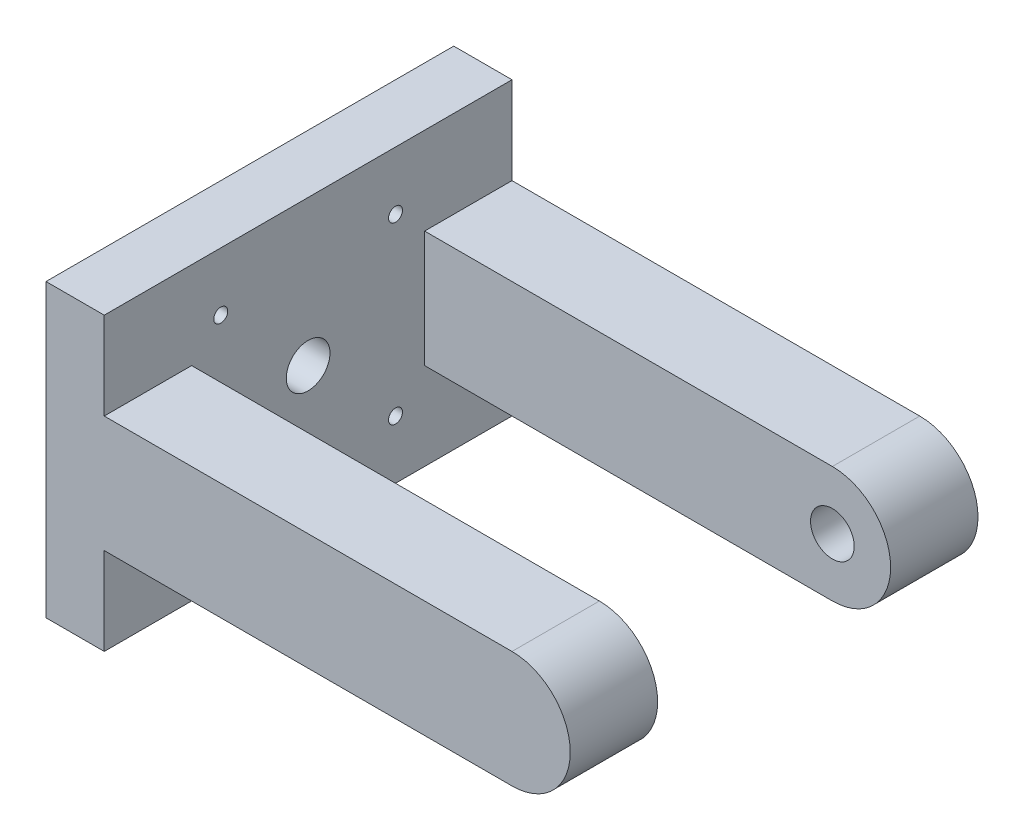
ISO-10303-21;
HEADER;
FILE_DESCRIPTION(('STEP AP214'),'2;1');
FILE_NAME('part.step','',(''),(''),'','','');
FILE_SCHEMA(('AUTOMOTIVE_DESIGN { 1 0 10303 214 1 1 1 1 }'));
ENDSEC;
DATA;
#1=APPLICATION_CONTEXT('core data for automotive mechanical design processes');
#2=APPLICATION_PROTOCOL_DEFINITION('international standard','automotive_design',2000,#1);
#3=PRODUCT_CONTEXT('',#1,'mechanical');
#4=PRODUCT('Part','Part','',(#3));
#5=PRODUCT_RELATED_PRODUCT_CATEGORY('part','',(#4));
#6=PRODUCT_DEFINITION_FORMATION('','',#4);
#7=PRODUCT_DEFINITION_CONTEXT('part definition',#1,'design');
#8=PRODUCT_DEFINITION('design','',#6,#7);
#9=PRODUCT_DEFINITION_SHAPE('','',#8);
#10=(LENGTH_UNIT() NAMED_UNIT(*) SI_UNIT(.MILLI.,.METRE.));
#11=(NAMED_UNIT(*) PLANE_ANGLE_UNIT() SI_UNIT($,.RADIAN.));
#12=(NAMED_UNIT(*) SI_UNIT($,.STERADIAN.) SOLID_ANGLE_UNIT());
#13=UNCERTAINTY_MEASURE_WITH_UNIT(LENGTH_MEASURE(1.E-05),#10,'distance_accuracy_value','');
#14=(GEOMETRIC_REPRESENTATION_CONTEXT(3) GLOBAL_UNCERTAINTY_ASSIGNED_CONTEXT((#13)) GLOBAL_UNIT_ASSIGNED_CONTEXT((#10,
#11,#12)) REPRESENTATION_CONTEXT('',''));
#15=CARTESIAN_POINT('',(0.,0.,0.));
#16=DIRECTION('',(0.,0.,1.));
#17=DIRECTION('',(1.,0.,0.));
#18=AXIS2_PLACEMENT_3D('',#15,#16,#17);
#19=CARTESIAN_POINT('',(35.,0.,-70.));
#20=DIRECTION('',(0.,0.,1.));
#21=DIRECTION('',(1.,0.,0.));
#22=AXIS2_PLACEMENT_3D('',#19,#20,#21);
#23=CYLINDRICAL_SURFACE('',#22,10.);
#24=CARTESIAN_POINT('',(35.,0.,-55.));
#25=DIRECTION('',(0.,0.,-1.));
#26=DIRECTION('',(-1.,0.,0.));
#27=AXIS2_PLACEMENT_3D('',#24,#25,#26);
#28=CIRCLE('',#27,10.);
#29=CARTESIAN_POINT('',(35.,-10.,-55.));
#30=VERTEX_POINT('',#29);
#31=CARTESIAN_POINT('',(35.,10.,-55.));
#32=VERTEX_POINT('',#31);
#33=EDGE_CURVE('E161',#30,#32,#28,.F.);
#34=ORIENTED_EDGE('',*,*,#33,.F.);
#35=DIRECTION('',(0.,0.,1.));
#36=VECTOR('',#35,1.);
#37=CARTESIAN_POINT('',(35.,-10.,-70.));
#38=LINE('',#37,#36);
#39=CARTESIAN_POINT('',(35.,-10.,-70.));
#40=VERTEX_POINT('',#39);
#41=EDGE_CURVE('E45',#40,#30,#38,.T.);
#42=ORIENTED_EDGE('',*,*,#41,.F.);
#43=CARTESIAN_POINT('',(35.,0.,-70.));
#44=DIRECTION('',(0.,0.,1.));
#45=DIRECTION('',(-1.,0.,0.));
#46=AXIS2_PLACEMENT_3D('',#43,#44,#45);
#47=CIRCLE('',#46,10.);
#48=CARTESIAN_POINT('',(35.,10.,-70.));
#49=VERTEX_POINT('',#48);
#50=EDGE_CURVE('E179',#40,#49,#47,.T.);
#51=ORIENTED_EDGE('',*,*,#50,.T.);
#52=DIRECTION('',(0.,0.,1.));
#53=VECTOR('',#52,1.);
#54=CARTESIAN_POINT('',(35.,10.,-70.));
#55=LINE('',#54,#53);
#56=EDGE_CURVE('E105',#49,#32,#55,.T.);
#57=ORIENTED_EDGE('',*,*,#56,.T.);
#58=EDGE_LOOP('',(#34,#42,#51,#57));
#59=FACE_BOUND('',#58,.T.);
#60=ADVANCED_FACE('F36',(#59),#23,.T.);
#61=CARTESIAN_POINT('',(-35.,-10.,-70.));
#62=DIRECTION('',(0.,-1.,0.));
#63=DIRECTION('',(0.,0.,-1.));
#64=AXIS2_PLACEMENT_3D('',#61,#62,#63);
#65=PLANE('',#64);
#66=DIRECTION('',(1.,0.,0.));
#67=VECTOR('',#66,1.);
#68=CARTESIAN_POINT('',(-35.,-10.,-55.));
#69=LINE('',#68,#67);
#70=CARTESIAN_POINT('',(-35.,-10.,-55.));
#71=VERTEX_POINT('',#70);
#72=EDGE_CURVE('E253',#71,#30,#69,.T.);
#73=ORIENTED_EDGE('',*,*,#72,.F.);
#74=DIRECTION('',(0.,0.,1.));
#75=VECTOR('',#74,1.);
#76=CARTESIAN_POINT('',(-35.,-10.,-70.));
#77=LINE('',#76,#75);
#78=CARTESIAN_POINT('',(-35.,-10.,-70.));
#79=VERTEX_POINT('',#78);
#80=EDGE_CURVE('E181',#79,#71,#77,.T.);
#81=ORIENTED_EDGE('',*,*,#80,.F.);
#82=DIRECTION('',(1.,0.,0.));
#83=VECTOR('',#82,1.);
#84=CARTESIAN_POINT('',(-35.,-10.,-70.));
#85=LINE('',#84,#83);
#86=EDGE_CURVE('E146',#79,#40,#85,.T.);
#87=ORIENTED_EDGE('',*,*,#86,.T.);
#88=ORIENTED_EDGE('',*,*,#41,.T.);
#89=EDGE_LOOP('',(#73,#81,#87,#88));
#90=FACE_BOUND('',#89,.T.);
#91=ADVANCED_FACE('F288',(#90),#65,.T.);
#92=CARTESIAN_POINT('',(-35.,10.,-70.));
#93=DIRECTION('',(0.,1.,0.));
#94=DIRECTION('',(0.,0.,1.));
#95=AXIS2_PLACEMENT_3D('',#92,#93,#94);
#96=PLANE('',#95);
#97=DIRECTION('',(-1.,0.,0.));
#98=VECTOR('',#97,1.);
#99=CARTESIAN_POINT('',(-35.,10.,-55.));
#100=LINE('',#99,#98);
#101=CARTESIAN_POINT('',(-35.,10.,-55.));
#102=VERTEX_POINT('',#101);
#103=EDGE_CURVE('E11',#32,#102,#100,.T.);
#104=ORIENTED_EDGE('',*,*,#103,.F.);
#105=ORIENTED_EDGE('',*,*,#56,.F.);
#106=DIRECTION('',(-1.,0.,0.));
#107=VECTOR('',#106,1.);
#108=CARTESIAN_POINT('',(-35.,10.,-70.));
#109=LINE('',#108,#107);
#110=CARTESIAN_POINT('',(-35.,10.,-70.));
#111=VERTEX_POINT('',#110);
#112=EDGE_CURVE('E259',#49,#111,#109,.T.);
#113=ORIENTED_EDGE('',*,*,#112,.T.);
#114=DIRECTION('',(0.,0.,1.));
#115=VECTOR('',#114,1.);
#116=CARTESIAN_POINT('',(-35.,10.,-70.));
#117=LINE('',#116,#115);
#118=EDGE_CURVE('E188',#111,#102,#117,.T.);
#119=ORIENTED_EDGE('',*,*,#118,.T.);
#120=EDGE_LOOP('',(#104,#105,#113,#119));
#121=FACE_BOUND('',#120,.T.);
#122=ADVANCED_FACE('F273',(#121),#96,.T.);
#123=CARTESIAN_POINT('',(35.,0.,-15.));
#124=DIRECTION('',(0.,0.,1.));
#125=DIRECTION('',(1.,0.,0.));
#126=AXIS2_PLACEMENT_3D('',#123,#124,#125);
#127=CIRCLE('',#126,10.);
#128=CARTESIAN_POINT('',(35.,10.,-15.));
#129=VERTEX_POINT('',#128);
#130=CARTESIAN_POINT('',(35.,-10.,-15.));
#131=VERTEX_POINT('',#130);
#132=EDGE_CURVE('E250',#129,#131,#127,.F.);
#133=ORIENTED_EDGE('',*,*,#132,.F.);
#134=CARTESIAN_POINT('',(35.,10.,0.));
#135=VERTEX_POINT('',#134);
#136=EDGE_CURVE('E156',#129,#135,#55,.T.);
#137=ORIENTED_EDGE('',*,*,#136,.T.);
#138=CARTESIAN_POINT('',(35.,0.,0.));
#139=DIRECTION('',(0.,0.,1.));
#140=DIRECTION('',(-1.,0.,0.));
#141=AXIS2_PLACEMENT_3D('',#138,#139,#140);
#142=CIRCLE('',#141,10.);
#143=CARTESIAN_POINT('',(35.,-10.,0.));
#144=VERTEX_POINT('',#143);
#145=EDGE_CURVE('E157',#144,#135,#142,.T.);
#146=ORIENTED_EDGE('',*,*,#145,.F.);
#147=EDGE_CURVE('E96',#131,#144,#38,.T.);
#148=ORIENTED_EDGE('',*,*,#147,.F.);
#149=EDGE_LOOP('',(#133,#137,#146,#148));
#150=FACE_BOUND('',#149,.T.);
#151=ADVANCED_FACE('F38',(#150),#23,.T.);
#152=DIRECTION('',(-1.,0.,0.));
#153=VECTOR('',#152,1.);
#154=CARTESIAN_POINT('',(-35.,-10.,-15.));
#155=LINE('',#154,#153);
#156=CARTESIAN_POINT('',(-35.,-10.,-15.));
#157=VERTEX_POINT('',#156);
#158=EDGE_CURVE('E247',#131,#157,#155,.T.);
#159=ORIENTED_EDGE('',*,*,#158,.F.);
#160=ORIENTED_EDGE('',*,*,#147,.T.);
#161=DIRECTION('',(1.,0.,0.));
#162=VECTOR('',#161,1.);
#163=CARTESIAN_POINT('',(-35.,-10.,0.));
#164=LINE('',#163,#162);
#165=CARTESIAN_POINT('',(-35.,-10.,0.));
#166=VERTEX_POINT('',#165);
#167=EDGE_CURVE('E176',#166,#144,#164,.T.);
#168=ORIENTED_EDGE('',*,*,#167,.F.);
#169=EDGE_CURVE('E136',#157,#166,#77,.T.);
#170=ORIENTED_EDGE('',*,*,#169,.F.);
#171=EDGE_LOOP('',(#159,#160,#168,#170));
#172=FACE_BOUND('',#171,.T.);
#173=ADVANCED_FACE('F291',(#172),#65,.T.);
#174=CARTESIAN_POINT('',(-35.,-25.,-70.));
#175=DIRECTION('',(1.,0.,0.));
#176=DIRECTION('',(0.,0.,-1.));
#177=AXIS2_PLACEMENT_3D('',#174,#175,#176);
#178=PLANE('',#177);
#179=CARTESIAN_POINT('',(-35.,15.,-50.));
#180=DIRECTION('',(1.,0.,0.));
#181=DIRECTION('',(0.,0.,-1.));
#182=AXIS2_PLACEMENT_3D('',#179,#180,#181);
#183=CIRCLE('',#182,1.19999999999999);
#184=CARTESIAN_POINT('',(-35.,15.,-51.2));
#185=VERTEX_POINT('',#184);
#186=EDGE_CURVE('E40',#185,#185,#183,.T.);
#187=ORIENTED_EDGE('',*,*,#186,.F.);
#188=EDGE_LOOP('',(#187));
#189=FACE_BOUND('',#188,.T.);
#190=CARTESIAN_POINT('',(-35.,15.,-20.));
#191=DIRECTION('',(1.,0.,0.));
#192=DIRECTION('',(0.,0.,-1.));
#193=AXIS2_PLACEMENT_3D('',#190,#191,#192);
#194=CIRCLE('',#193,1.19999999999999);
#195=CARTESIAN_POINT('',(-35.,15.,-21.2));
#196=VERTEX_POINT('',#195);
#197=EDGE_CURVE('E202',#196,#196,#194,.T.);
#198=ORIENTED_EDGE('',*,*,#197,.F.);
#199=EDGE_LOOP('',(#198));
#200=FACE_BOUND('',#199,.T.);
#201=CARTESIAN_POINT('',(-35.,-15.,-20.));
#202=DIRECTION('',(1.,0.,0.));
#203=DIRECTION('',(0.,0.,-1.));
#204=AXIS2_PLACEMENT_3D('',#201,#202,#203);
#205=CIRCLE('',#204,1.19999999999999);
#206=CARTESIAN_POINT('',(-35.,-15.,-21.2));
#207=VERTEX_POINT('',#206);
#208=EDGE_CURVE('E198',#207,#207,#205,.T.);
#209=ORIENTED_EDGE('',*,*,#208,.F.);
#210=EDGE_LOOP('',(#209));
#211=FACE_BOUND('',#210,.T.);
#212=CARTESIAN_POINT('',(-35.,-15.,-50.));
#213=DIRECTION('',(1.,0.,0.));
#214=DIRECTION('',(0.,0.,-1.));
#215=AXIS2_PLACEMENT_3D('',#212,#213,#214);
#216=CIRCLE('',#215,1.19999999999999);
#217=CARTESIAN_POINT('',(-35.,-15.,-51.2));
#218=VERTEX_POINT('',#217);
#219=EDGE_CURVE('E193',#218,#218,#216,.T.);
#220=ORIENTED_EDGE('',*,*,#219,.F.);
#221=EDGE_LOOP('',(#220));
#222=FACE_BOUND('',#221,.T.);
#223=CARTESIAN_POINT('',(-35.,0.,-35.));
#224=DIRECTION('',(1.,0.,0.));
#225=DIRECTION('',(0.,0.,-1.));
#226=AXIS2_PLACEMENT_3D('',#223,#224,#225);
#227=CIRCLE('',#226,3.75000000000001);
#228=CARTESIAN_POINT('',(-35.,0.,-38.75));
#229=VERTEX_POINT('',#228);
#230=EDGE_CURVE('E196',#229,#229,#227,.T.);
#231=ORIENTED_EDGE('',*,*,#230,.F.);
#232=EDGE_LOOP('',(#231));
#233=FACE_BOUND('',#232,.T.);
#234=DIRECTION('',(0.,1.,0.));
#235=VECTOR('',#234,1.);
#236=CARTESIAN_POINT('',(-35.,-25.,0.));
#237=LINE('',#236,#235);
#238=CARTESIAN_POINT('',(-35.,-25.,0.));
#239=VERTEX_POINT('',#238);
#240=EDGE_CURVE('E131',#239,#166,#237,.T.);
#241=ORIENTED_EDGE('',*,*,#240,.F.);
#242=DIRECTION('',(0.,0.,1.));
#243=VECTOR('',#242,1.);
#244=CARTESIAN_POINT('',(-35.,-25.,-70.));
#245=LINE('',#244,#243);
#246=CARTESIAN_POINT('',(-35.,-25.,-70.));
#247=VERTEX_POINT('',#246);
#248=EDGE_CURVE('E124',#247,#239,#245,.T.);
#249=ORIENTED_EDGE('',*,*,#248,.F.);
#250=DIRECTION('',(0.,1.,0.));
#251=VECTOR('',#250,1.);
#252=CARTESIAN_POINT('',(-35.,-25.,-70.));
#253=LINE('',#252,#251);
#254=EDGE_CURVE('E128',#247,#79,#253,.T.);
#255=ORIENTED_EDGE('',*,*,#254,.T.);
#256=ORIENTED_EDGE('',*,*,#80,.T.);
#257=DIRECTION('',(0.,1.,0.));
#258=VECTOR('',#257,1.);
#259=CARTESIAN_POINT('',(-35.,-25.,-55.));
#260=LINE('',#259,#258);
#261=EDGE_CURVE('E244',#71,#102,#260,.T.);
#262=ORIENTED_EDGE('',*,*,#261,.T.);
#263=ORIENTED_EDGE('',*,*,#118,.F.);
#264=DIRECTION('',(0.,1.,0.));
#265=VECTOR('',#264,1.);
#266=CARTESIAN_POINT('',(-35.,10.,-70.));
#267=LINE('',#266,#265);
#268=CARTESIAN_POINT('',(-35.,25.,-70.));
#269=VERTEX_POINT('',#268);
#270=EDGE_CURVE('E261',#111,#269,#267,.T.);
#271=ORIENTED_EDGE('',*,*,#270,.T.);
#272=DIRECTION('',(0.,0.,1.));
#273=VECTOR('',#272,1.);
#274=CARTESIAN_POINT('',(-35.,25.,-70.));
#275=LINE('',#274,#273);
#276=CARTESIAN_POINT('',(-35.,25.,0.));
#277=VERTEX_POINT('',#276);
#278=EDGE_CURVE('E186',#269,#277,#275,.T.);
#279=ORIENTED_EDGE('',*,*,#278,.T.);
#280=DIRECTION('',(0.,1.,0.));
#281=VECTOR('',#280,1.);
#282=CARTESIAN_POINT('',(-35.,10.,0.));
#283=LINE('',#282,#281);
#284=CARTESIAN_POINT('',(-35.,10.,0.));
#285=VERTEX_POINT('',#284);
#286=EDGE_CURVE('E164',#285,#277,#283,.T.);
#287=ORIENTED_EDGE('',*,*,#286,.F.);
#288=CARTESIAN_POINT('',(-35.,10.,-15.));
#289=VERTEX_POINT('',#288);
#290=EDGE_CURVE('E191',#289,#285,#117,.T.);
#291=ORIENTED_EDGE('',*,*,#290,.F.);
#292=DIRECTION('',(0.,1.,0.));
#293=VECTOR('',#292,1.);
#294=CARTESIAN_POINT('',(-35.,-25.,-15.));
#295=LINE('',#294,#293);
#296=EDGE_CURVE('E53',#157,#289,#295,.T.);
#297=ORIENTED_EDGE('',*,*,#296,.F.);
#298=ORIENTED_EDGE('',*,*,#169,.T.);
#299=EDGE_LOOP('',(#241,#249,#255,#256,#262,#263,#271,#279,#287,#291,#297,#298));
#300=FACE_BOUND('',#299,.T.);
#301=ADVANCED_FACE('F126',(#189,#200,#211,#222,#233,#300),#178,.T.);
#302=CARTESIAN_POINT('',(-45.,-25.,-70.));
#303=DIRECTION('',(0.,-1.,0.));
#304=DIRECTION('',(0.,0.,-1.));
#305=AXIS2_PLACEMENT_3D('',#302,#303,#304);
#306=PLANE('',#305);
#307=DIRECTION('',(1.,0.,0.));
#308=VECTOR('',#307,1.);
#309=CARTESIAN_POINT('',(-45.,-25.,0.));
#310=LINE('',#309,#308);
#311=CARTESIAN_POINT('',(-45.,-25.,0.));
#312=VERTEX_POINT('',#311);
#313=EDGE_CURVE('E173',#312,#239,#310,.T.);
#314=ORIENTED_EDGE('',*,*,#313,.F.);
#315=DIRECTION('',(0.,0.,1.));
#316=VECTOR('',#315,1.);
#317=CARTESIAN_POINT('',(-45.,-25.,-70.));
#318=LINE('',#317,#316);
#319=CARTESIAN_POINT('',(-45.,-25.,-70.));
#320=VERTEX_POINT('',#319);
#321=EDGE_CURVE('E137',#320,#312,#318,.T.);
#322=ORIENTED_EDGE('',*,*,#321,.F.);
#323=DIRECTION('',(1.,0.,0.));
#324=VECTOR('',#323,1.);
#325=CARTESIAN_POINT('',(-45.,-25.,-70.));
#326=LINE('',#325,#324);
#327=EDGE_CURVE('E143',#320,#247,#326,.T.);
#328=ORIENTED_EDGE('',*,*,#327,.T.);
#329=ORIENTED_EDGE('',*,*,#248,.T.);
#330=EDGE_LOOP('',(#314,#322,#328,#329));
#331=FACE_BOUND('',#330,.T.);
#332=ADVANCED_FACE('F148',(#331),#306,.T.);
#333=CARTESIAN_POINT('',(-45.,25.,-70.));
#334=DIRECTION('',(-1.,0.,0.));
#335=DIRECTION('',(0.,-1.,0.));
#336=AXIS2_PLACEMENT_3D('',#333,#334,#335);
#337=PLANE('',#336);
#338=CARTESIAN_POINT('',(-45.,15.,-50.));
#339=DIRECTION('',(-1.,0.,0.));
#340=DIRECTION('',(0.,0.,1.));
#341=AXIS2_PLACEMENT_3D('',#338,#339,#340);
#342=CIRCLE('',#341,2.2);
#343=CARTESIAN_POINT('',(-45.,15.,-47.8));
#344=VERTEX_POINT('',#343);
#345=EDGE_CURVE('E510',#344,#344,#342,.T.);
#346=ORIENTED_EDGE('',*,*,#345,.F.);
#347=EDGE_LOOP('',(#346));
#348=FACE_BOUND('',#347,.T.);
#349=CARTESIAN_POINT('',(-45.,15.,-20.));
#350=DIRECTION('',(-1.,0.,0.));
#351=DIRECTION('',(0.,0.,1.));
#352=AXIS2_PLACEMENT_3D('',#349,#350,#351);
#353=CIRCLE('',#352,2.2);
#354=CARTESIAN_POINT('',(-45.,15.,-17.8));
#355=VERTEX_POINT('',#354);
#356=EDGE_CURVE('E211',#355,#355,#353,.T.);
#357=ORIENTED_EDGE('',*,*,#356,.F.);
#358=EDGE_LOOP('',(#357));
#359=FACE_BOUND('',#358,.T.);
#360=CARTESIAN_POINT('',(-45.,-15.,-20.));
#361=DIRECTION('',(-1.,0.,0.));
#362=DIRECTION('',(0.,0.,1.));
#363=AXIS2_PLACEMENT_3D('',#360,#361,#362);
#364=CIRCLE('',#363,2.2);
#365=CARTESIAN_POINT('',(-45.,-15.,-17.8));
#366=VERTEX_POINT('',#365);
#367=EDGE_CURVE('E204',#366,#366,#364,.T.);
#368=ORIENTED_EDGE('',*,*,#367,.F.);
#369=EDGE_LOOP('',(#368));
#370=FACE_BOUND('',#369,.T.);
#371=CARTESIAN_POINT('',(-45.,-15.,-50.));
#372=DIRECTION('',(-1.,0.,0.));
#373=DIRECTION('',(0.,0.,1.));
#374=AXIS2_PLACEMENT_3D('',#371,#372,#373);
#375=CIRCLE('',#374,2.2);
#376=CARTESIAN_POINT('',(-45.,-15.,-47.8));
#377=VERTEX_POINT('',#376);
#378=EDGE_CURVE('E200',#377,#377,#375,.T.);
#379=ORIENTED_EDGE('',*,*,#378,.F.);
#380=EDGE_LOOP('',(#379));
#381=FACE_BOUND('',#380,.T.);
#382=CARTESIAN_POINT('',(-45.,0.,-35.));
#383=DIRECTION('',(1.,0.,0.));
#384=DIRECTION('',(0.,0.,-1.));
#385=AXIS2_PLACEMENT_3D('',#382,#383,#384);
#386=CIRCLE('',#385,3.75000000000001);
#387=CARTESIAN_POINT('',(-45.,0.,-38.75));
#388=VERTEX_POINT('',#387);
#389=EDGE_CURVE('E225',#388,#388,#386,.T.);
#390=ORIENTED_EDGE('',*,*,#389,.T.);
#391=EDGE_LOOP('',(#390));
#392=FACE_BOUND('',#391,.T.);
#393=DIRECTION('',(0.,-1.,0.));
#394=VECTOR('',#393,1.);
#395=CARTESIAN_POINT('',(-45.,25.,0.));
#396=LINE('',#395,#394);
#397=CARTESIAN_POINT('',(-45.,25.,0.));
#398=VERTEX_POINT('',#397);
#399=EDGE_CURVE('E170',#398,#312,#396,.T.);
#400=ORIENTED_EDGE('',*,*,#399,.F.);
#401=DIRECTION('',(0.,0.,1.));
#402=VECTOR('',#401,1.);
#403=CARTESIAN_POINT('',(-45.,25.,-70.));
#404=LINE('',#403,#402);
#405=CARTESIAN_POINT('',(-45.,25.,-70.));
#406=VERTEX_POINT('',#405);
#407=EDGE_CURVE('E184',#406,#398,#404,.T.);
#408=ORIENTED_EDGE('',*,*,#407,.F.);
#409=DIRECTION('',(0.,-1.,0.));
#410=VECTOR('',#409,1.);
#411=CARTESIAN_POINT('',(-45.,25.,-70.));
#412=LINE('',#411,#410);
#413=EDGE_CURVE('E149',#406,#320,#412,.T.);
#414=ORIENTED_EDGE('',*,*,#413,.T.);
#415=ORIENTED_EDGE('',*,*,#321,.T.);
#416=EDGE_LOOP('',(#400,#408,#414,#415));
#417=FACE_BOUND('',#416,.T.);
#418=ADVANCED_FACE('F313',(#348,#359,#370,#381,#392,#417),#337,.T.);
#419=CARTESIAN_POINT('',(-35.,25.,-70.));
#420=DIRECTION('',(0.,1.,0.));
#421=DIRECTION('',(0.,0.,1.));
#422=AXIS2_PLACEMENT_3D('',#419,#420,#421);
#423=PLANE('',#422);
#424=DIRECTION('',(-1.,0.,0.));
#425=VECTOR('',#424,1.);
#426=CARTESIAN_POINT('',(-35.,25.,0.));
#427=LINE('',#426,#425);
#428=EDGE_CURVE('E167',#277,#398,#427,.T.);
#429=ORIENTED_EDGE('',*,*,#428,.F.);
#430=ORIENTED_EDGE('',*,*,#278,.F.);
#431=DIRECTION('',(-1.,0.,0.));
#432=VECTOR('',#431,1.);
#433=CARTESIAN_POINT('',(-35.,25.,-70.));
#434=LINE('',#433,#432);
#435=EDGE_CURVE('E151',#269,#406,#434,.T.);
#436=ORIENTED_EDGE('',*,*,#435,.T.);
#437=ORIENTED_EDGE('',*,*,#407,.T.);
#438=EDGE_LOOP('',(#429,#430,#436,#437));
#439=FACE_BOUND('',#438,.T.);
#440=ADVANCED_FACE('F267',(#439),#423,.T.);
#441=DIRECTION('',(1.,0.,0.));
#442=VECTOR('',#441,1.);
#443=CARTESIAN_POINT('',(-35.,10.,-15.));
#444=LINE('',#443,#442);
#445=EDGE_CURVE('E240',#289,#129,#444,.T.);
#446=ORIENTED_EDGE('',*,*,#445,.F.);
#447=ORIENTED_EDGE('',*,*,#290,.T.);
#448=DIRECTION('',(-1.,0.,0.));
#449=VECTOR('',#448,1.);
#450=CARTESIAN_POINT('',(-35.,10.,0.));
#451=LINE('',#450,#449);
#452=EDGE_CURVE('E160',#135,#285,#451,.T.);
#453=ORIENTED_EDGE('',*,*,#452,.F.);
#454=ORIENTED_EDGE('',*,*,#136,.F.);
#455=EDGE_LOOP('',(#446,#447,#453,#454));
#456=FACE_BOUND('',#455,.T.);
#457=ADVANCED_FACE('F296',(#456),#96,.T.);
#458=CARTESIAN_POINT('',(35.,0.,-70.));
#459=DIRECTION('',(0.,0.,-1.));
#460=DIRECTION('',(-1.,0.,0.));
#461=AXIS2_PLACEMENT_3D('',#458,#459,#460);
#462=PLANE('',#461);
#463=ORIENTED_EDGE('',*,*,#50,.F.);
#464=ORIENTED_EDGE('',*,*,#86,.F.);
#465=ORIENTED_EDGE('',*,*,#254,.F.);
#466=ORIENTED_EDGE('',*,*,#327,.F.);
#467=ORIENTED_EDGE('',*,*,#413,.F.);
#468=ORIENTED_EDGE('',*,*,#435,.F.);
#469=ORIENTED_EDGE('',*,*,#270,.F.);
#470=ORIENTED_EDGE('',*,*,#112,.F.);
#471=EDGE_LOOP('',(#463,#464,#465,#466,#467,#468,#469,#470));
#472=FACE_BOUND('',#471,.T.);
#473=ADVANCED_FACE('F141',(#472),#462,.T.);
#474=CARTESIAN_POINT('',(35.,0.,0.));
#475=DIRECTION('',(0.,0.,-1.));
#476=DIRECTION('',(-1.,0.,0.));
#477=AXIS2_PLACEMENT_3D('',#474,#475,#476);
#478=PLANE('',#477);
#479=ORIENTED_EDGE('',*,*,#145,.T.);
#480=ORIENTED_EDGE('',*,*,#452,.T.);
#481=ORIENTED_EDGE('',*,*,#286,.T.);
#482=ORIENTED_EDGE('',*,*,#428,.T.);
#483=ORIENTED_EDGE('',*,*,#399,.T.);
#484=ORIENTED_EDGE('',*,*,#313,.T.);
#485=ORIENTED_EDGE('',*,*,#240,.T.);
#486=ORIENTED_EDGE('',*,*,#167,.T.);
#487=EDGE_LOOP('',(#479,#480,#481,#482,#483,#484,#485,#486));
#488=FACE_BOUND('',#487,.T.);
#489=ADVANCED_FACE('F311',(#488),#478,.F.);
#490=CARTESIAN_POINT('',(-35.,-25.,-55.));
#491=DIRECTION('',(0.,0.,-1.));
#492=DIRECTION('',(-1.,0.,0.));
#493=AXIS2_PLACEMENT_3D('',#490,#491,#492);
#494=PLANE('',#493);
#495=CARTESIAN_POINT('',(35.,0.,-55.));
#496=DIRECTION('',(0.,0.,1.));
#497=DIRECTION('',(1.,0.,0.));
#498=AXIS2_PLACEMENT_3D('',#495,#496,#497);
#499=CIRCLE('',#498,3.75000000000001);
#500=CARTESIAN_POINT('',(38.75,0.,-55.));
#501=VERTEX_POINT('',#500);
#502=EDGE_CURVE('E234',#501,#501,#499,.T.);
#503=ORIENTED_EDGE('',*,*,#502,.F.);
#504=EDGE_LOOP('',(#503));
#505=FACE_BOUND('',#504,.T.);
#506=ORIENTED_EDGE('',*,*,#33,.T.);
#507=ORIENTED_EDGE('',*,*,#103,.T.);
#508=ORIENTED_EDGE('',*,*,#261,.F.);
#509=ORIENTED_EDGE('',*,*,#72,.T.);
#510=EDGE_LOOP('',(#506,#507,#508,#509));
#511=FACE_BOUND('',#510,.T.);
#512=ADVANCED_FACE('F286',(#505,#511),#494,.F.);
#513=CARTESIAN_POINT('',(-35.,-25.,-15.));
#514=DIRECTION('',(0.,0.,1.));
#515=DIRECTION('',(1.,0.,0.));
#516=AXIS2_PLACEMENT_3D('',#513,#514,#515);
#517=PLANE('',#516);
#518=CARTESIAN_POINT('',(33.8855166410781,0.,-15.));
#519=DIRECTION('',(0.,0.,-1.));
#520=DIRECTION('',(-1.,0.,0.));
#521=AXIS2_PLACEMENT_3D('',#518,#519,#520);
#522=CIRCLE('',#521,3.75);
#523=CARTESIAN_POINT('',(30.1355166410781,0.,-15.));
#524=VERTEX_POINT('',#523);
#525=EDGE_CURVE('E228',#524,#524,#522,.T.);
#526=ORIENTED_EDGE('',*,*,#525,.F.);
#527=EDGE_LOOP('',(#526));
#528=FACE_BOUND('',#527,.T.);
#529=ORIENTED_EDGE('',*,*,#132,.T.);
#530=ORIENTED_EDGE('',*,*,#158,.T.);
#531=ORIENTED_EDGE('',*,*,#296,.T.);
#532=ORIENTED_EDGE('',*,*,#445,.T.);
#533=EDGE_LOOP('',(#529,#530,#531,#532));
#534=FACE_BOUND('',#533,.T.);
#535=ADVANCED_FACE('F332',(#528,#534),#517,.F.);
#536=CARTESIAN_POINT('',(35.,0.,-65.));
#537=DIRECTION('',(0.,0.,1.));
#538=DIRECTION('',(1.,0.,0.));
#539=AXIS2_PLACEMENT_3D('',#536,#537,#538);
#540=CYLINDRICAL_SURFACE('',#539,3.75000000000001);
#541=CARTESIAN_POINT('',(35.,0.,-65.));
#542=DIRECTION('',(0.,0.,1.));
#543=DIRECTION('',(1.,0.,0.));
#544=AXIS2_PLACEMENT_3D('',#541,#542,#543);
#545=CIRCLE('',#544,3.75000000000001);
#546=CARTESIAN_POINT('',(38.75,0.,-65.));
#547=VERTEX_POINT('',#546);
#548=EDGE_CURVE('E237',#547,#547,#545,.T.);
#549=ORIENTED_EDGE('',*,*,#548,.F.);
#550=EDGE_LOOP('',(#549));
#551=FACE_BOUND('',#550,.T.);
#552=ORIENTED_EDGE('',*,*,#502,.T.);
#553=EDGE_LOOP('',(#552));
#554=FACE_BOUND('',#553,.T.);
#555=ADVANCED_FACE('F334',(#551,#554),#540,.F.);
#556=CARTESIAN_POINT('',(35.,0.,-65.));
#557=DIRECTION('',(0.,0.,1.));
#558=DIRECTION('',(1.,0.,0.));
#559=AXIS2_PLACEMENT_3D('',#556,#557,#558);
#560=PLANE('',#559);
#561=ORIENTED_EDGE('',*,*,#548,.T.);
#562=EDGE_LOOP('',(#561));
#563=FACE_BOUND('',#562,.T.);
#564=ADVANCED_FACE('F341',(#563),#560,.T.);
#565=CARTESIAN_POINT('',(33.8855166410781,0.,-5.));
#566=DIRECTION('',(0.,0.,-1.));
#567=DIRECTION('',(-1.,0.,0.));
#568=AXIS2_PLACEMENT_3D('',#565,#566,#567);
#569=CYLINDRICAL_SURFACE('',#568,3.75);
#570=CARTESIAN_POINT('',(33.8855166410781,0.,-5.));
#571=DIRECTION('',(0.,0.,-1.));
#572=DIRECTION('',(-1.,0.,0.));
#573=AXIS2_PLACEMENT_3D('',#570,#571,#572);
#574=CIRCLE('',#573,3.75);
#575=CARTESIAN_POINT('',(30.1355166410781,0.,-5.));
#576=VERTEX_POINT('',#575);
#577=EDGE_CURVE('E231',#576,#576,#574,.T.);
#578=ORIENTED_EDGE('',*,*,#577,.F.);
#579=EDGE_LOOP('',(#578));
#580=FACE_BOUND('',#579,.T.);
#581=ORIENTED_EDGE('',*,*,#525,.T.);
#582=EDGE_LOOP('',(#581));
#583=FACE_BOUND('',#582,.T.);
#584=ADVANCED_FACE('F376',(#580,#583),#569,.F.);
#585=CARTESIAN_POINT('',(33.8855166410781,0.,-5.));
#586=DIRECTION('',(0.,0.,-1.));
#587=DIRECTION('',(-1.,0.,0.));
#588=AXIS2_PLACEMENT_3D('',#585,#586,#587);
#589=PLANE('',#588);
#590=ORIENTED_EDGE('',*,*,#577,.T.);
#591=EDGE_LOOP('',(#590));
#592=FACE_BOUND('',#591,.T.);
#593=ADVANCED_FACE('F390',(#592),#589,.T.);
#594=CARTESIAN_POINT('',(-45.,0.,-35.));
#595=DIRECTION('',(1.,0.,0.));
#596=DIRECTION('',(0.,0.,-1.));
#597=AXIS2_PLACEMENT_3D('',#594,#595,#596);
#598=CYLINDRICAL_SURFACE('',#597,3.75000000000001);
#599=ORIENTED_EDGE('',*,*,#389,.F.);
#600=EDGE_LOOP('',(#599));
#601=FACE_BOUND('',#600,.T.);
#602=ORIENTED_EDGE('',*,*,#230,.T.);
#603=EDGE_LOOP('',(#602));
#604=FACE_BOUND('',#603,.T.);
#605=ADVANCED_FACE('F400',(#601,#604),#598,.F.);
#606=CARTESIAN_POINT('',(-45.,-15.,-50.));
#607=DIRECTION('',(-1.,0.,0.));
#608=DIRECTION('',(0.,0.,1.));
#609=AXIS2_PLACEMENT_3D('',#606,#607,#608);
#610=CYLINDRICAL_SURFACE('',#609,1.19999999999999);
#611=ORIENTED_EDGE('',*,*,#219,.T.);
#612=EDGE_LOOP('',(#611));
#613=FACE_BOUND('',#612,.T.);
#614=CARTESIAN_POINT('',(-44.,-15.,-50.));
#615=DIRECTION('',(-1.,0.,0.));
#616=DIRECTION('',(0.,0.,1.));
#617=AXIS2_PLACEMENT_3D('',#614,#615,#616);
#618=CIRCLE('',#617,1.2);
#619=CARTESIAN_POINT('',(-44.,-15.,-48.8));
#620=VERTEX_POINT('',#619);
#621=EDGE_CURVE('E197',#620,#620,#618,.T.);
#622=ORIENTED_EDGE('',*,*,#621,.T.);
#623=EDGE_LOOP('',(#622));
#624=FACE_BOUND('',#623,.T.);
#625=ADVANCED_FACE('F410',(#613,#624),#610,.F.);
#626=CARTESIAN_POINT('',(-45.,-15.,-50.));
#627=DIRECTION('',(-1.,0.,0.));
#628=DIRECTION('',(0.,0.,1.));
#629=AXIS2_PLACEMENT_3D('',#626,#627,#628);
#630=CONICAL_SURFACE('',#629,2.2,0.785398163397449);
#631=ORIENTED_EDGE('',*,*,#621,.F.);
#632=EDGE_LOOP('',(#631));
#633=FACE_BOUND('',#632,.T.);
#634=ORIENTED_EDGE('',*,*,#378,.T.);
#635=EDGE_LOOP('',(#634));
#636=FACE_BOUND('',#635,.T.);
#637=ADVANCED_FACE('F432',(#633,#636),#630,.F.);
#638=CARTESIAN_POINT('',(-45.,-15.,-20.));
#639=DIRECTION('',(-1.,0.,0.));
#640=DIRECTION('',(0.,0.,1.));
#641=AXIS2_PLACEMENT_3D('',#638,#639,#640);
#642=CYLINDRICAL_SURFACE('',#641,1.19999999999999);
#643=ORIENTED_EDGE('',*,*,#208,.T.);
#644=EDGE_LOOP('',(#643));
#645=FACE_BOUND('',#644,.T.);
#646=CARTESIAN_POINT('',(-44.,-15.,-20.));
#647=DIRECTION('',(-1.,0.,0.));
#648=DIRECTION('',(0.,0.,1.));
#649=AXIS2_PLACEMENT_3D('',#646,#647,#648);
#650=CIRCLE('',#649,1.2);
#651=CARTESIAN_POINT('',(-44.,-15.,-18.8));
#652=VERTEX_POINT('',#651);
#653=EDGE_CURVE('E201',#652,#652,#650,.T.);
#654=ORIENTED_EDGE('',*,*,#653,.T.);
#655=EDGE_LOOP('',(#654));
#656=FACE_BOUND('',#655,.T.);
#657=ADVANCED_FACE('F442',(#645,#656),#642,.F.);
#658=CARTESIAN_POINT('',(-45.,-15.,-20.));
#659=DIRECTION('',(-1.,0.,0.));
#660=DIRECTION('',(0.,0.,1.));
#661=AXIS2_PLACEMENT_3D('',#658,#659,#660);
#662=CONICAL_SURFACE('',#661,2.2,0.785398163397449);
#663=ORIENTED_EDGE('',*,*,#653,.F.);
#664=EDGE_LOOP('',(#663));
#665=FACE_BOUND('',#664,.T.);
#666=ORIENTED_EDGE('',*,*,#367,.T.);
#667=EDGE_LOOP('',(#666));
#668=FACE_BOUND('',#667,.T.);
#669=ADVANCED_FACE('F452',(#665,#668),#662,.F.);
#670=CARTESIAN_POINT('',(-45.,15.,-20.));
#671=DIRECTION('',(-1.,0.,0.));
#672=DIRECTION('',(0.,0.,1.));
#673=AXIS2_PLACEMENT_3D('',#670,#671,#672);
#674=CYLINDRICAL_SURFACE('',#673,1.19999999999999);
#675=ORIENTED_EDGE('',*,*,#197,.T.);
#676=EDGE_LOOP('',(#675));
#677=FACE_BOUND('',#676,.T.);
#678=CARTESIAN_POINT('',(-44.,15.,-20.));
#679=DIRECTION('',(-1.,0.,0.));
#680=DIRECTION('',(0.,0.,1.));
#681=AXIS2_PLACEMENT_3D('',#678,#679,#680);
#682=CIRCLE('',#681,1.2);
#683=CARTESIAN_POINT('',(-44.,15.,-18.8));
#684=VERTEX_POINT('',#683);
#685=EDGE_CURVE('E205',#684,#684,#682,.T.);
#686=ORIENTED_EDGE('',*,*,#685,.T.);
#687=EDGE_LOOP('',(#686));
#688=FACE_BOUND('',#687,.T.);
#689=ADVANCED_FACE('F462',(#677,#688),#674,.F.);
#690=CARTESIAN_POINT('',(-45.,15.,-20.));
#691=DIRECTION('',(-1.,0.,0.));
#692=DIRECTION('',(0.,0.,1.));
#693=AXIS2_PLACEMENT_3D('',#690,#691,#692);
#694=CONICAL_SURFACE('',#693,2.2,0.785398163397448);
#695=ORIENTED_EDGE('',*,*,#685,.F.);
#696=EDGE_LOOP('',(#695));
#697=FACE_BOUND('',#696,.T.);
#698=ORIENTED_EDGE('',*,*,#356,.T.);
#699=EDGE_LOOP('',(#698));
#700=FACE_BOUND('',#699,.T.);
#701=ADVANCED_FACE('F472',(#697,#700),#694,.F.);
#702=CARTESIAN_POINT('',(-45.,15.,-50.));
#703=DIRECTION('',(-1.,0.,0.));
#704=DIRECTION('',(0.,0.,1.));
#705=AXIS2_PLACEMENT_3D('',#702,#703,#704);
#706=CYLINDRICAL_SURFACE('',#705,1.19999999999999);
#707=ORIENTED_EDGE('',*,*,#186,.T.);
#708=EDGE_LOOP('',(#707));
#709=FACE_BOUND('',#708,.T.);
#710=CARTESIAN_POINT('',(-44.,15.,-50.));
#711=DIRECTION('',(-1.,0.,0.));
#712=DIRECTION('',(0.,0.,1.));
#713=AXIS2_PLACEMENT_3D('',#710,#711,#712);
#714=CIRCLE('',#713,1.2);
#715=CARTESIAN_POINT('',(-44.,15.,-48.8));
#716=VERTEX_POINT('',#715);
#717=EDGE_CURVE('E508',#716,#716,#714,.T.);
#718=ORIENTED_EDGE('',*,*,#717,.T.);
#719=EDGE_LOOP('',(#718));
#720=FACE_BOUND('',#719,.T.);
#721=ADVANCED_FACE('F481',(#709,#720),#706,.F.);
#722=CARTESIAN_POINT('',(-45.,15.,-50.));
#723=DIRECTION('',(-1.,0.,0.));
#724=DIRECTION('',(0.,0.,1.));
#725=AXIS2_PLACEMENT_3D('',#722,#723,#724);
#726=CONICAL_SURFACE('',#725,2.2,0.785398163397448);
#727=ORIENTED_EDGE('',*,*,#717,.F.);
#728=EDGE_LOOP('',(#727));
#729=FACE_BOUND('',#728,.T.);
#730=ORIENTED_EDGE('',*,*,#345,.T.);
#731=EDGE_LOOP('',(#730));
#732=FACE_BOUND('',#731,.T.);
#733=ADVANCED_FACE('F491',(#729,#732),#726,.F.);
#734=CLOSED_SHELL('',(#60,#91,#122,#151,#173,#301,#332,#418,#440,#457,#473,#489,#512,#535,#555,
#564,#584,#593,#605,#625,#637,#657,#669,#689,#701,#721,#733));
#735=MANIFOLD_SOLID_BREP('B2',#734);
#736=ADVANCED_BREP_SHAPE_REPRESENTATION('',(#18,#735),#14);
#737=SHAPE_DEFINITION_REPRESENTATION(#9,#736);
ENDSEC;
END-ISO-10303-21;
